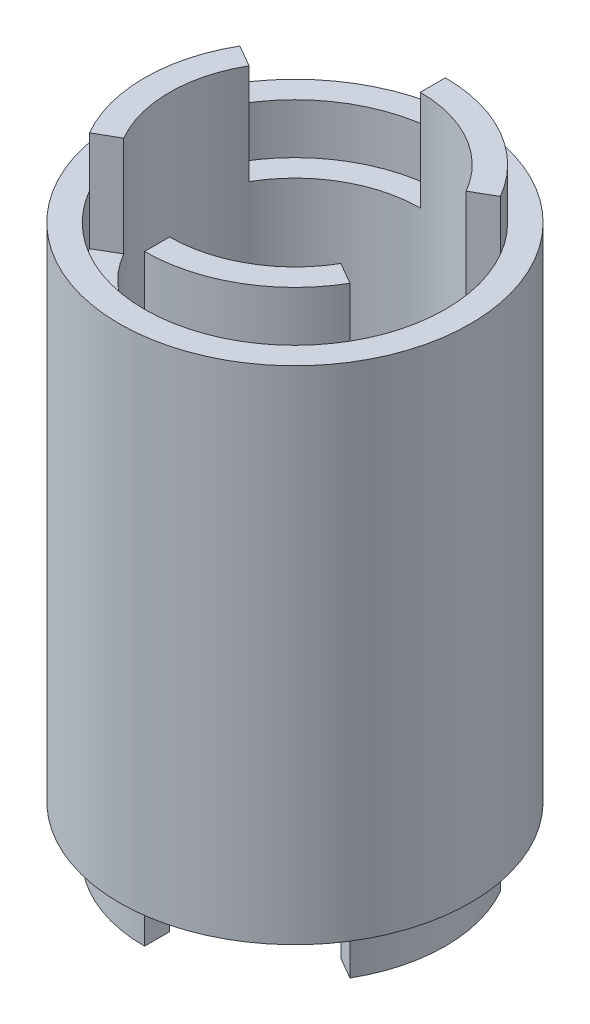
ISO-10303-21;
HEADER;
FILE_DESCRIPTION(('STEP AP214'),'2;1');
FILE_NAME('part.step','',(''),(''),'','','');
FILE_SCHEMA(('AUTOMOTIVE_DESIGN { 1 0 10303 214 1 1 1 1 }'));
ENDSEC;
DATA;
#1=APPLICATION_CONTEXT('core data for automotive mechanical design processes');
#2=APPLICATION_PROTOCOL_DEFINITION('international standard','automotive_design',2000,#1);
#3=PRODUCT_CONTEXT('',#1,'mechanical');
#4=PRODUCT('Part','Part','',(#3));
#5=PRODUCT_RELATED_PRODUCT_CATEGORY('part','',(#4));
#6=PRODUCT_DEFINITION_FORMATION('','',#4);
#7=PRODUCT_DEFINITION_CONTEXT('part definition',#1,'design');
#8=PRODUCT_DEFINITION('design','',#6,#7);
#9=PRODUCT_DEFINITION_SHAPE('','',#8);
#10=(LENGTH_UNIT() NAMED_UNIT(*) SI_UNIT(.MILLI.,.METRE.));
#11=(NAMED_UNIT(*) PLANE_ANGLE_UNIT() SI_UNIT($,.RADIAN.));
#12=(NAMED_UNIT(*) SI_UNIT($,.STERADIAN.) SOLID_ANGLE_UNIT());
#13=UNCERTAINTY_MEASURE_WITH_UNIT(LENGTH_MEASURE(1.E-05),#10,'distance_accuracy_value','');
#14=(GEOMETRIC_REPRESENTATION_CONTEXT(3) GLOBAL_UNCERTAINTY_ASSIGNED_CONTEXT((#13)) GLOBAL_UNIT_ASSIGNED_CONTEXT((#10,
#11,#12)) REPRESENTATION_CONTEXT('',''));
#15=CARTESIAN_POINT('',(0.,0.,0.));
#16=DIRECTION('',(0.,0.,1.));
#17=DIRECTION('',(1.,0.,0.));
#18=AXIS2_PLACEMENT_3D('',#15,#16,#17);
#19=CARTESIAN_POINT('',(0.,-30.,0.));
#20=DIRECTION('',(0.,1.,0.));
#21=DIRECTION('',(0.,0.,1.));
#22=AXIS2_PLACEMENT_3D('',#19,#20,#21);
#23=CYLINDRICAL_SURFACE('',#22,15.);
#24=CARTESIAN_POINT('',(0.,-30.,0.));
#25=DIRECTION('',(0.,-1.,0.));
#26=DIRECTION('',(0.,0.,-1.));
#27=AXIS2_PLACEMENT_3D('',#24,#25,#26);
#28=CIRCLE('',#27,15.);
#29=CARTESIAN_POINT('',(-12.9903810567667,-30.,-7.49999999999988));
#30=VERTEX_POINT('',#29);
#31=CARTESIAN_POINT('',(-1.04744440165294E-13,-30.,-15.));
#32=VERTEX_POINT('',#31);
#33=EDGE_CURVE('E500',#30,#32,#28,.T.);
#34=ORIENTED_EDGE('',*,*,#33,.F.);
#35=DIRECTION('',(0.,-1.,0.));
#36=VECTOR('',#35,1.);
#37=CARTESIAN_POINT('',(-12.9903810567667,-20.,-7.49999999999988));
#38=LINE('',#37,#36);
#39=CARTESIAN_POINT('',(-12.9903810567667,-25.,-7.49999999999988));
#40=VERTEX_POINT('',#39);
#41=EDGE_CURVE('E591',#40,#30,#38,.T.);
#42=ORIENTED_EDGE('',*,*,#41,.F.);
#43=CARTESIAN_POINT('',(0.,-25.,0.));
#44=DIRECTION('',(0.,1.,0.));
#45=DIRECTION('',(0.,0.,1.));
#46=AXIS2_PLACEMENT_3D('',#43,#44,#45);
#47=CIRCLE('',#46,15.);
#48=CARTESIAN_POINT('',(-1.04744440165294E-13,-25.,-15.));
#49=VERTEX_POINT('',#48);
#50=EDGE_CURVE('E511',#40,#49,#47,.F.);
#51=ORIENTED_EDGE('',*,*,#50,.T.);
#52=DIRECTION('',(0.,-1.,0.));
#53=VECTOR('',#52,1.);
#54=CARTESIAN_POINT('',(-1.04744440165294E-13,-20.,-15.));
#55=LINE('',#54,#53);
#56=EDGE_CURVE('E335',#49,#32,#55,.T.);
#57=ORIENTED_EDGE('',*,*,#56,.T.);
#58=EDGE_LOOP('',(#34,#42,#51,#57));
#59=FACE_BOUND('',#58,.T.);
#60=ADVANCED_FACE('F47',(#59),#23,.T.);
#61=CARTESIAN_POINT('',(0.,-25.,15.));
#62=VERTEX_POINT('',#61);
#63=CARTESIAN_POINT('',(-12.9903810567666,-25.,7.49999999999999));
#64=VERTEX_POINT('',#63);
#65=EDGE_CURVE('E506',#62,#64,#47,.F.);
#66=ORIENTED_EDGE('',*,*,#65,.T.);
#67=DIRECTION('',(0.,-1.,0.));
#68=VECTOR('',#67,1.);
#69=CARTESIAN_POINT('',(-12.9903810567666,-20.,7.49999999999999));
#70=LINE('',#69,#68);
#71=CARTESIAN_POINT('',(-12.9903810567666,-30.,7.49999999999999));
#72=VERTEX_POINT('',#71);
#73=EDGE_CURVE('E270',#64,#72,#70,.T.);
#74=ORIENTED_EDGE('',*,*,#73,.T.);
#75=CARTESIAN_POINT('',(0.,-30.,15.));
#76=VERTEX_POINT('',#75);
#77=EDGE_CURVE('E504',#76,#72,#28,.T.);
#78=ORIENTED_EDGE('',*,*,#77,.F.);
#79=DIRECTION('',(0.,-1.,0.));
#80=VECTOR('',#79,1.);
#81=CARTESIAN_POINT('',(0.,-20.,15.));
#82=LINE('',#81,#80);
#83=EDGE_CURVE('E291',#62,#76,#82,.T.);
#84=ORIENTED_EDGE('',*,*,#83,.F.);
#85=EDGE_LOOP('',(#66,#74,#78,#84));
#86=FACE_BOUND('',#85,.T.);
#87=ADVANCED_FACE('F601',(#86),#23,.T.);
#88=CARTESIAN_POINT('',(0.,-30.,0.));
#89=DIRECTION('',(0.,-1.,0.));
#90=DIRECTION('',(0.,0.,-1.));
#91=AXIS2_PLACEMENT_3D('',#88,#89,#90);
#92=PLANE('',#91);
#93=DIRECTION('',(0.866025403784443,0.,0.499999999999992));
#94=VECTOR('',#93,1.);
#95=CARTESIAN_POINT('',(-10.8253175473055,-30.,-6.2499999999999));
#96=LINE('',#95,#94);
#97=CARTESIAN_POINT('',(-10.8253175473055,-30.,-6.2499999999999));
#98=VERTEX_POINT('',#97);
#99=EDGE_CURVE('E262',#30,#98,#96,.T.);
#100=ORIENTED_EDGE('',*,*,#99,.F.);
#101=ORIENTED_EDGE('',*,*,#33,.T.);
#102=DIRECTION('',(0.,0.,-1.));
#103=VECTOR('',#102,1.);
#104=CARTESIAN_POINT('',(0.,-30.,-12.5));
#105=LINE('',#104,#103);
#106=CARTESIAN_POINT('',(0.,-30.,-12.5));
#107=VERTEX_POINT('',#106);
#108=EDGE_CURVE('E336',#107,#32,#105,.T.);
#109=ORIENTED_EDGE('',*,*,#108,.F.);
#110=CARTESIAN_POINT('',(0.,-30.,0.));
#111=DIRECTION('',(0.,-1.,0.));
#112=DIRECTION('',(0.,0.,-1.));
#113=AXIS2_PLACEMENT_3D('',#110,#111,#112);
#114=CIRCLE('',#113,12.5);
#115=EDGE_CURVE('E495',#98,#107,#114,.T.);
#116=ORIENTED_EDGE('',*,*,#115,.F.);
#117=EDGE_LOOP('',(#100,#101,#109,#116));
#118=FACE_BOUND('',#117,.T.);
#119=ADVANCED_FACE('F617',(#118),#92,.T.);
#120=DIRECTION('',(-0.86602540378447,0.,0.499999999999945));
#121=VECTOR('',#120,1.);
#122=CARTESIAN_POINT('',(-10.8253175473054,-30.,6.25000000000013));
#123=LINE('',#122,#121);
#124=CARTESIAN_POINT('',(-10.8253175473054,-30.,6.25000000000013));
#125=VERTEX_POINT('',#124);
#126=EDGE_CURVE('E303',#125,#72,#123,.T.);
#127=ORIENTED_EDGE('',*,*,#126,.F.);
#128=CARTESIAN_POINT('',(0.,-30.,12.5));
#129=VERTEX_POINT('',#128);
#130=EDGE_CURVE('E268',#129,#125,#114,.T.);
#131=ORIENTED_EDGE('',*,*,#130,.F.);
#132=DIRECTION('',(0.,0.,-1.));
#133=VECTOR('',#132,1.);
#134=CARTESIAN_POINT('',(0.,-30.,12.5));
#135=LINE('',#134,#133);
#136=EDGE_CURVE('E296',#76,#129,#135,.T.);
#137=ORIENTED_EDGE('',*,*,#136,.F.);
#138=ORIENTED_EDGE('',*,*,#77,.T.);
#139=EDGE_LOOP('',(#127,#131,#137,#138));
#140=FACE_BOUND('',#139,.T.);
#141=ADVANCED_FACE('F657',(#140),#92,.T.);
#142=CARTESIAN_POINT('',(0.,25.,0.));
#143=DIRECTION('',(0.,-1.,0.));
#144=DIRECTION('',(0.,0.,-1.));
#145=AXIS2_PLACEMENT_3D('',#142,#143,#144);
#146=CYLINDRICAL_SURFACE('',#145,15.);
#147=CARTESIAN_POINT('',(0.,20.,0.));
#148=DIRECTION('',(0.,1.,0.));
#149=DIRECTION('',(0.,0.,1.));
#150=AXIS2_PLACEMENT_3D('',#147,#148,#149);
#151=CIRCLE('',#150,15.);
#152=CARTESIAN_POINT('',(12.9903810567665,20.,7.50000000000006));
#153=VERTEX_POINT('',#152);
#154=CARTESIAN_POINT('',(12.9903810567666,20.,-7.5));
#155=VERTEX_POINT('',#154);
#156=EDGE_CURVE('E371',#153,#155,#151,.T.);
#157=ORIENTED_EDGE('',*,*,#156,.F.);
#158=DIRECTION('',(0.,-1.,0.));
#159=VECTOR('',#158,1.);
#160=CARTESIAN_POINT('',(12.9903810567665,30.,7.50000000000006));
#161=LINE('',#160,#159);
#162=CARTESIAN_POINT('',(12.9903810567665,25.,7.50000000000006));
#163=VERTEX_POINT('',#162);
#164=EDGE_CURVE('E404',#163,#153,#161,.T.);
#165=ORIENTED_EDGE('',*,*,#164,.F.);
#166=CARTESIAN_POINT('',(0.,25.,0.));
#167=DIRECTION('',(0.,1.,0.));
#168=DIRECTION('',(0.,0.,1.));
#169=AXIS2_PLACEMENT_3D('',#166,#167,#168);
#170=CIRCLE('',#169,15.);
#171=CARTESIAN_POINT('',(12.9903810567666,25.,-7.5));
#172=VERTEX_POINT('',#171);
#173=EDGE_CURVE('E510',#163,#172,#170,.T.);
#174=ORIENTED_EDGE('',*,*,#173,.T.);
#175=DIRECTION('',(0.,-1.,0.));
#176=VECTOR('',#175,1.);
#177=CARTESIAN_POINT('',(12.9903810567666,25.,-7.5));
#178=LINE('',#177,#176);
#179=EDGE_CURVE('E56',#172,#155,#178,.T.);
#180=ORIENTED_EDGE('',*,*,#179,.T.);
#181=EDGE_LOOP('',(#157,#165,#174,#180));
#182=FACE_BOUND('',#181,.T.);
#183=ADVANCED_FACE('F530',(#182),#146,.F.);
#184=CARTESIAN_POINT('',(0.,20.,0.));
#185=DIRECTION('',(0.,1.,0.));
#186=DIRECTION('',(0.,0.,1.));
#187=AXIS2_PLACEMENT_3D('',#184,#185,#186);
#188=CIRCLE('',#187,15.);
#189=CARTESIAN_POINT('',(-12.9903810567666,20.,7.49999999999988));
#190=VERTEX_POINT('',#189);
#191=CARTESIAN_POINT('',(0.,20.,15.));
#192=VERTEX_POINT('',#191);
#193=EDGE_CURVE('E389',#190,#192,#188,.T.);
#194=ORIENTED_EDGE('',*,*,#193,.F.);
#195=DIRECTION('',(0.,-1.,0.));
#196=VECTOR('',#195,1.);
#197=CARTESIAN_POINT('',(-12.9903810567667,30.,7.49999999999988));
#198=LINE('',#197,#196);
#199=CARTESIAN_POINT('',(-12.9903810567667,25.,7.49999999999988));
#200=VERTEX_POINT('',#199);
#201=EDGE_CURVE('E444',#200,#190,#198,.T.);
#202=ORIENTED_EDGE('',*,*,#201,.F.);
#203=CARTESIAN_POINT('',(0.,25.,15.));
#204=VERTEX_POINT('',#203);
#205=EDGE_CURVE('E554',#200,#204,#170,.T.);
#206=ORIENTED_EDGE('',*,*,#205,.T.);
#207=DIRECTION('',(0.,-1.,0.));
#208=VECTOR('',#207,1.);
#209=CARTESIAN_POINT('',(0.,30.,15.));
#210=LINE('',#209,#208);
#211=EDGE_CURVE('E417',#204,#192,#210,.T.);
#212=ORIENTED_EDGE('',*,*,#211,.T.);
#213=EDGE_LOOP('',(#194,#202,#206,#212));
#214=FACE_BOUND('',#213,.T.);
#215=ADVANCED_FACE('F665',(#214),#146,.F.);
#216=CARTESIAN_POINT('',(0.,20.,0.));
#217=DIRECTION('',(0.,1.,0.));
#218=DIRECTION('',(0.,0.,1.));
#219=AXIS2_PLACEMENT_3D('',#216,#217,#218);
#220=CIRCLE('',#219,15.);
#221=CARTESIAN_POINT('',(0.,20.,-15.));
#222=VERTEX_POINT('',#221);
#223=CARTESIAN_POINT('',(-12.9903810567666,20.,-7.49999999999999));
#224=VERTEX_POINT('',#223);
#225=EDGE_CURVE('E392',#222,#224,#220,.T.);
#226=ORIENTED_EDGE('',*,*,#225,.F.);
#227=DIRECTION('',(0.,-1.,0.));
#228=VECTOR('',#227,1.);
#229=CARTESIAN_POINT('',(0.,25.,-15.));
#230=LINE('',#229,#228);
#231=CARTESIAN_POINT('',(0.,25.,-15.));
#232=VERTEX_POINT('',#231);
#233=EDGE_CURVE('E11',#222,#232,#230,.F.);
#234=ORIENTED_EDGE('',*,*,#233,.T.);
#235=CARTESIAN_POINT('',(-12.9903810567666,25.,-7.49999999999999));
#236=VERTEX_POINT('',#235);
#237=EDGE_CURVE('E518',#232,#236,#170,.T.);
#238=ORIENTED_EDGE('',*,*,#237,.T.);
#239=DIRECTION('',(0.,-1.,0.));
#240=VECTOR('',#239,1.);
#241=CARTESIAN_POINT('',(-12.9903810567666,30.,-7.49999999999999));
#242=LINE('',#241,#240);
#243=EDGE_CURVE('E439',#236,#224,#242,.T.);
#244=ORIENTED_EDGE('',*,*,#243,.T.);
#245=EDGE_LOOP('',(#226,#234,#238,#244));
#246=FACE_BOUND('',#245,.T.);
#247=ADVANCED_FACE('F667',(#246),#146,.F.);
#248=CARTESIAN_POINT('',(0.,17.5,0.));
#249=DIRECTION('',(0.,-1.,0.));
#250=DIRECTION('',(0.,0.,-1.));
#251=AXIS2_PLACEMENT_3D('',#248,#249,#250);
#252=CYLINDRICAL_SURFACE('',#251,12.5);
#253=DIRECTION('',(0.,-1.,0.));
#254=VECTOR('',#253,1.);
#255=CARTESIAN_POINT('',(-10.8253175473055,-20.,-6.2499999999999));
#256=LINE('',#255,#254);
#257=CARTESIAN_POINT('',(-10.8253175473055,-20.,-6.2499999999999));
#258=VERTEX_POINT('',#257);
#259=EDGE_CURVE('E360',#258,#98,#256,.T.);
#260=ORIENTED_EDGE('',*,*,#259,.T.);
#261=ORIENTED_EDGE('',*,*,#115,.T.);
#262=DIRECTION('',(0.,-1.,0.));
#263=VECTOR('',#262,1.);
#264=CARTESIAN_POINT('',(0.,-20.,-12.5));
#265=LINE('',#264,#263);
#266=CARTESIAN_POINT('',(0.,-20.,-12.5));
#267=VERTEX_POINT('',#266);
#268=EDGE_CURVE('E328',#267,#107,#265,.T.);
#269=ORIENTED_EDGE('',*,*,#268,.F.);
#270=CARTESIAN_POINT('',(0.,-20.,0.));
#271=DIRECTION('',(0.,1.,0.));
#272=DIRECTION('',(0.,0.,-1.));
#273=AXIS2_PLACEMENT_3D('',#270,#271,#272);
#274=CIRCLE('',#273,12.5);
#275=CARTESIAN_POINT('',(10.8253175473055,-20.,-6.25000000000005));
#276=VERTEX_POINT('',#275);
#277=EDGE_CURVE('E345',#276,#267,#274,.T.);
#278=ORIENTED_EDGE('',*,*,#277,.F.);
#279=DIRECTION('',(0.,-1.,0.));
#280=VECTOR('',#279,1.);
#281=CARTESIAN_POINT('',(10.8253175473055,-20.,-6.25000000000005));
#282=LINE('',#281,#280);
#283=CARTESIAN_POINT('',(10.8253175473055,-30.,-6.25000000000005));
#284=VERTEX_POINT('',#283);
#285=EDGE_CURVE('E324',#276,#284,#282,.T.);
#286=ORIENTED_EDGE('',*,*,#285,.T.);
#287=CARTESIAN_POINT('',(10.8253175473055,-30.,6.24999999999998));
#288=VERTEX_POINT('',#287);
#289=EDGE_CURVE('E499',#284,#288,#114,.T.);
#290=ORIENTED_EDGE('',*,*,#289,.T.);
#291=DIRECTION('',(0.,-1.,0.));
#292=VECTOR('',#291,1.);
#293=CARTESIAN_POINT('',(10.8253175473055,-20.,6.24999999999998));
#294=LINE('',#293,#292);
#295=CARTESIAN_POINT('',(10.8253175473055,-20.,6.24999999999998));
#296=VERTEX_POINT('',#295);
#297=EDGE_CURVE('E71',#296,#288,#294,.T.);
#298=ORIENTED_EDGE('',*,*,#297,.F.);
#299=CARTESIAN_POINT('',(0.,-20.,0.));
#300=DIRECTION('',(0.,1.,0.));
#301=DIRECTION('',(0.,0.,-1.));
#302=AXIS2_PLACEMENT_3D('',#299,#300,#301);
#303=CIRCLE('',#302,12.5);
#304=CARTESIAN_POINT('',(0.,-20.,12.5));
#305=VERTEX_POINT('',#304);
#306=EDGE_CURVE('E300',#305,#296,#303,.T.);
#307=ORIENTED_EDGE('',*,*,#306,.F.);
#308=DIRECTION('',(0.,-1.,0.));
#309=VECTOR('',#308,1.);
#310=CARTESIAN_POINT('',(0.,-20.,12.5));
#311=LINE('',#310,#309);
#312=EDGE_CURVE('E292',#305,#129,#311,.T.);
#313=ORIENTED_EDGE('',*,*,#312,.T.);
#314=ORIENTED_EDGE('',*,*,#130,.T.);
#315=DIRECTION('',(0.,-1.,0.));
#316=VECTOR('',#315,1.);
#317=CARTESIAN_POINT('',(-10.8253175473054,-20.,6.25000000000013));
#318=LINE('',#317,#316);
#319=CARTESIAN_POINT('',(-10.8253175473054,-20.,6.25000000000013));
#320=VERTEX_POINT('',#319);
#321=EDGE_CURVE('E63',#320,#125,#318,.T.);
#322=ORIENTED_EDGE('',*,*,#321,.F.);
#323=CARTESIAN_POINT('',(0.,-20.,0.));
#324=DIRECTION('',(0.,1.,0.));
#325=DIRECTION('',(0.,0.,-1.));
#326=AXIS2_PLACEMENT_3D('',#323,#324,#325);
#327=CIRCLE('',#326,12.5);
#328=EDGE_CURVE('E252',#258,#320,#327,.T.);
#329=ORIENTED_EDGE('',*,*,#328,.F.);
#330=EDGE_LOOP('',(#260,#261,#269,#278,#286,#290,#298,#307,#313,#314,#322,#329));
#331=FACE_BOUND('',#330,.T.);
#332=DIRECTION('',(0.,-1.,0.));
#333=VECTOR('',#332,1.);
#334=CARTESIAN_POINT('',(0.,30.,-12.5));
#335=LINE('',#334,#333);
#336=CARTESIAN_POINT('',(0.,30.,-12.5));
#337=VERTEX_POINT('',#336);
#338=CARTESIAN_POINT('',(0.,20.,-12.5));
#339=VERTEX_POINT('',#338);
#340=EDGE_CURVE('E487',#337,#339,#335,.T.);
#341=ORIENTED_EDGE('',*,*,#340,.T.);
#342=CARTESIAN_POINT('',(0.,20.,0.));
#343=DIRECTION('',(0.,-1.,0.));
#344=DIRECTION('',(0.,0.,1.));
#345=AXIS2_PLACEMENT_3D('',#342,#343,#344);
#346=CIRCLE('',#345,12.5);
#347=CARTESIAN_POINT('',(-10.8253175473055,20.,-6.25));
#348=VERTEX_POINT('',#347);
#349=EDGE_CURVE('E398',#348,#339,#346,.T.);
#350=ORIENTED_EDGE('',*,*,#349,.F.);
#351=DIRECTION('',(0.,-1.,0.));
#352=VECTOR('',#351,1.);
#353=CARTESIAN_POINT('',(-10.8253175473055,30.,-6.24999999999999));
#354=LINE('',#353,#352);
#355=CARTESIAN_POINT('',(-10.8253175473055,30.,-6.24999999999999));
#356=VERTEX_POINT('',#355);
#357=EDGE_CURVE('E435',#356,#348,#354,.T.);
#358=ORIENTED_EDGE('',*,*,#357,.F.);
#359=CARTESIAN_POINT('',(0.,30.,0.));
#360=DIRECTION('',(0.,-1.,0.));
#361=DIRECTION('',(0.,0.,1.));
#362=AXIS2_PLACEMENT_3D('',#359,#360,#361);
#363=CIRCLE('',#362,12.5);
#364=CARTESIAN_POINT('',(-10.8253175473055,30.,6.2499999999999));
#365=VERTEX_POINT('',#364);
#366=EDGE_CURVE('E462',#365,#356,#363,.T.);
#367=ORIENTED_EDGE('',*,*,#366,.F.);
#368=DIRECTION('',(0.,-1.,0.));
#369=VECTOR('',#368,1.);
#370=CARTESIAN_POINT('',(-10.8253175473055,30.,6.2499999999999));
#371=LINE('',#370,#369);
#372=CARTESIAN_POINT('',(-10.8253175473055,20.,6.2499999999999));
#373=VERTEX_POINT('',#372);
#374=EDGE_CURVE('E449',#365,#373,#371,.T.);
#375=ORIENTED_EDGE('',*,*,#374,.T.);
#376=CARTESIAN_POINT('',(0.,20.,0.));
#377=DIRECTION('',(0.,-1.,0.));
#378=DIRECTION('',(0.,0.,1.));
#379=AXIS2_PLACEMENT_3D('',#376,#377,#378);
#380=CIRCLE('',#379,12.5);
#381=CARTESIAN_POINT('',(0.,20.,12.5));
#382=VERTEX_POINT('',#381);
#383=EDGE_CURVE('E383',#382,#373,#380,.T.);
#384=ORIENTED_EDGE('',*,*,#383,.F.);
#385=DIRECTION('',(0.,-1.,0.));
#386=VECTOR('',#385,1.);
#387=CARTESIAN_POINT('',(0.,30.,12.5));
#388=LINE('',#387,#386);
#389=CARTESIAN_POINT('',(0.,30.,12.5));
#390=VERTEX_POINT('',#389);
#391=EDGE_CURVE('E413',#390,#382,#388,.T.);
#392=ORIENTED_EDGE('',*,*,#391,.F.);
#393=CARTESIAN_POINT('',(0.,30.,0.));
#394=DIRECTION('',(0.,-1.,0.));
#395=DIRECTION('',(0.,0.,1.));
#396=AXIS2_PLACEMENT_3D('',#393,#394,#395);
#397=CIRCLE('',#396,12.5);
#398=CARTESIAN_POINT('',(10.8253175473055,30.,6.25000000000005));
#399=VERTEX_POINT('',#398);
#400=EDGE_CURVE('E425',#399,#390,#397,.T.);
#401=ORIENTED_EDGE('',*,*,#400,.F.);
#402=DIRECTION('',(0.,-1.,0.));
#403=VECTOR('',#402,1.);
#404=CARTESIAN_POINT('',(10.8253175473055,30.,6.25000000000005));
#405=LINE('',#404,#403);
#406=CARTESIAN_POINT('',(10.8253175473055,20.,6.25000000000005));
#407=VERTEX_POINT('',#406);
#408=EDGE_CURVE('E409',#399,#407,#405,.T.);
#409=ORIENTED_EDGE('',*,*,#408,.T.);
#410=CARTESIAN_POINT('',(0.,20.,0.));
#411=DIRECTION('',(0.,-1.,0.));
#412=DIRECTION('',(0.,0.,1.));
#413=AXIS2_PLACEMENT_3D('',#410,#411,#412);
#414=CIRCLE('',#413,12.5);
#415=CARTESIAN_POINT('',(10.8253175473055,20.,-6.25));
#416=VERTEX_POINT('',#415);
#417=EDGE_CURVE('E377',#416,#407,#414,.T.);
#418=ORIENTED_EDGE('',*,*,#417,.F.);
#419=DIRECTION('',(0.,-1.,0.));
#420=VECTOR('',#419,1.);
#421=CARTESIAN_POINT('',(10.8253175473055,30.,-6.25));
#422=LINE('',#421,#420);
#423=CARTESIAN_POINT('',(10.8253175473055,30.,-6.25));
#424=VERTEX_POINT('',#423);
#425=EDGE_CURVE('E483',#424,#416,#422,.T.);
#426=ORIENTED_EDGE('',*,*,#425,.F.);
#427=CARTESIAN_POINT('',(0.,30.,0.));
#428=DIRECTION('',(0.,-1.,0.));
#429=DIRECTION('',(0.,0.,1.));
#430=AXIS2_PLACEMENT_3D('',#427,#428,#429);
#431=CIRCLE('',#430,12.5);
#432=EDGE_CURVE('E473',#337,#424,#431,.T.);
#433=ORIENTED_EDGE('',*,*,#432,.F.);
#434=EDGE_LOOP('',(#341,#350,#358,#367,#375,#384,#392,#401,#409,#418,#426,#433));
#435=FACE_BOUND('',#434,.T.);
#436=ADVANCED_FACE('F49',(#331,#435),#252,.F.);
#437=CARTESIAN_POINT('',(0.,25.,0.));
#438=DIRECTION('',(0.,1.,0.));
#439=DIRECTION('',(0.,0.,1.));
#440=AXIS2_PLACEMENT_3D('',#437,#438,#439);
#441=PLANE('',#440);
#442=CARTESIAN_POINT('',(0.,25.,0.));
#443=DIRECTION('',(0.,1.,0.));
#444=DIRECTION('',(0.,0.,1.));
#445=AXIS2_PLACEMENT_3D('',#442,#443,#444);
#446=CIRCLE('',#445,17.5);
#447=CARTESIAN_POINT('',(0.,25.,17.5));
#448=VERTEX_POINT('',#447);
#449=EDGE_CURVE('E519',#448,#448,#446,.T.);
#450=ORIENTED_EDGE('',*,*,#449,.T.);
#451=EDGE_LOOP('',(#450));
#452=FACE_BOUND('',#451,.T.);
#453=EDGE_CURVE('E513',#172,#232,#170,.T.);
#454=ORIENTED_EDGE('',*,*,#453,.F.);
#455=ORIENTED_EDGE('',*,*,#173,.F.);
#456=EDGE_CURVE('E559',#204,#163,#170,.T.);
#457=ORIENTED_EDGE('',*,*,#456,.F.);
#458=ORIENTED_EDGE('',*,*,#205,.F.);
#459=EDGE_CURVE('E548',#236,#200,#170,.T.);
#460=ORIENTED_EDGE('',*,*,#459,.F.);
#461=ORIENTED_EDGE('',*,*,#237,.F.);
#462=EDGE_LOOP('',(#454,#455,#457,#458,#460,#461));
#463=FACE_BOUND('',#462,.T.);
#464=ADVANCED_FACE('F545',(#452,#463),#441,.T.);
#465=CARTESIAN_POINT('',(0.,-25.,0.));
#466=DIRECTION('',(0.,1.,0.));
#467=DIRECTION('',(0.,0.,1.));
#468=AXIS2_PLACEMENT_3D('',#465,#466,#467);
#469=PLANE('',#468);
#470=CARTESIAN_POINT('',(0.,-25.,0.));
#471=DIRECTION('',(0.,1.,0.));
#472=DIRECTION('',(0.,0.,1.));
#473=AXIS2_PLACEMENT_3D('',#470,#471,#472);
#474=CIRCLE('',#473,17.5);
#475=CARTESIAN_POINT('',(0.,-25.,17.5));
#476=VERTEX_POINT('',#475);
#477=EDGE_CURVE('E517',#476,#476,#474,.T.);
#478=ORIENTED_EDGE('',*,*,#477,.F.);
#479=EDGE_LOOP('',(#478));
#480=FACE_BOUND('',#479,.T.);
#481=ORIENTED_EDGE('',*,*,#65,.F.);
#482=CARTESIAN_POINT('',(0.,-25.,0.));
#483=DIRECTION('',(0.,1.,0.));
#484=DIRECTION('',(0.,0.,1.));
#485=AXIS2_PLACEMENT_3D('',#482,#483,#484);
#486=CIRCLE('',#485,15.);
#487=CARTESIAN_POINT('',(12.9903810567666,-25.,7.49999999999997));
#488=VERTEX_POINT('',#487);
#489=EDGE_CURVE('E359',#62,#488,#486,.T.);
#490=ORIENTED_EDGE('',*,*,#489,.T.);
#491=CARTESIAN_POINT('',(12.9903810567665,-25.,-7.50000000000006));
#492=VERTEX_POINT('',#491);
#493=EDGE_CURVE('E512',#492,#488,#47,.F.);
#494=ORIENTED_EDGE('',*,*,#493,.F.);
#495=CARTESIAN_POINT('',(0.,-25.,0.));
#496=DIRECTION('',(0.,1.,0.));
#497=DIRECTION('',(0.,0.,1.));
#498=AXIS2_PLACEMENT_3D('',#495,#496,#497);
#499=CIRCLE('',#498,15.);
#500=EDGE_CURVE('E355',#492,#49,#499,.T.);
#501=ORIENTED_EDGE('',*,*,#500,.T.);
#502=ORIENTED_EDGE('',*,*,#50,.F.);
#503=CARTESIAN_POINT('',(0.,-25.,0.));
#504=DIRECTION('',(0.,1.,0.));
#505=DIRECTION('',(0.,0.,1.));
#506=AXIS2_PLACEMENT_3D('',#503,#504,#505);
#507=CIRCLE('',#506,15.);
#508=EDGE_CURVE('E364',#40,#64,#507,.T.);
#509=ORIENTED_EDGE('',*,*,#508,.T.);
#510=EDGE_LOOP('',(#481,#490,#494,#501,#502,#509));
#511=FACE_BOUND('',#510,.T.);
#512=ADVANCED_FACE('F598',(#480,#511),#469,.F.);
#513=CARTESIAN_POINT('',(0.,25.,0.));
#514=DIRECTION('',(0.,-1.,0.));
#515=DIRECTION('',(0.,0.,-1.));
#516=AXIS2_PLACEMENT_3D('',#513,#514,#515);
#517=CYLINDRICAL_SURFACE('',#516,17.5);
#518=ORIENTED_EDGE('',*,*,#449,.F.);
#519=EDGE_LOOP('',(#518));
#520=FACE_BOUND('',#519,.T.);
#521=ORIENTED_EDGE('',*,*,#477,.T.);
#522=EDGE_LOOP('',(#521));
#523=FACE_BOUND('',#522,.T.);
#524=ADVANCED_FACE('F677',(#520,#523),#517,.T.);
#525=ORIENTED_EDGE('',*,*,#493,.T.);
#526=DIRECTION('',(0.,-1.,0.));
#527=VECTOR('',#526,1.);
#528=CARTESIAN_POINT('',(12.9903810567666,-20.,7.49999999999997));
#529=LINE('',#528,#527);
#530=CARTESIAN_POINT('',(12.9903810567666,-30.,7.49999999999997));
#531=VERTEX_POINT('',#530);
#532=EDGE_CURVE('E286',#488,#531,#529,.T.);
#533=ORIENTED_EDGE('',*,*,#532,.T.);
#534=CARTESIAN_POINT('',(12.9903810567665,-30.,-7.50000000000006));
#535=VERTEX_POINT('',#534);
#536=EDGE_CURVE('E505',#535,#531,#28,.T.);
#537=ORIENTED_EDGE('',*,*,#536,.F.);
#538=DIRECTION('',(0.,-1.,0.));
#539=VECTOR('',#538,1.);
#540=CARTESIAN_POINT('',(12.9903810567665,-20.,-7.50000000000006));
#541=LINE('',#540,#539);
#542=EDGE_CURVE('E323',#492,#535,#541,.T.);
#543=ORIENTED_EDGE('',*,*,#542,.F.);
#544=EDGE_LOOP('',(#525,#533,#537,#543));
#545=FACE_BOUND('',#544,.T.);
#546=ADVANCED_FACE('F646',(#545),#23,.T.);
#547=DIRECTION('',(0.86602540378444,0.,0.499999999999998));
#548=VECTOR('',#547,1.);
#549=CARTESIAN_POINT('',(10.8253175473055,-30.,6.24999999999998));
#550=LINE('',#549,#548);
#551=EDGE_CURVE('E299',#288,#531,#550,.T.);
#552=ORIENTED_EDGE('',*,*,#551,.F.);
#553=ORIENTED_EDGE('',*,*,#289,.F.);
#554=DIRECTION('',(-0.866025403784436,0.,0.500000000000004));
#555=VECTOR('',#554,1.);
#556=CARTESIAN_POINT('',(10.8253175473055,-30.,-6.25000000000005));
#557=LINE('',#556,#555);
#558=EDGE_CURVE('E295',#535,#284,#557,.T.);
#559=ORIENTED_EDGE('',*,*,#558,.F.);
#560=ORIENTED_EDGE('',*,*,#536,.T.);
#561=EDGE_LOOP('',(#552,#553,#559,#560));
#562=FACE_BOUND('',#561,.T.);
#563=ADVANCED_FACE('F641',(#562),#92,.T.);
#564=CARTESIAN_POINT('',(0.,30.,0.));
#565=DIRECTION('',(0.,-1.,0.));
#566=DIRECTION('',(0.,0.,-1.));
#567=AXIS2_PLACEMENT_3D('',#564,#565,#566);
#568=CYLINDRICAL_SURFACE('',#567,15.);
#569=ORIENTED_EDGE('',*,*,#453,.T.);
#570=DIRECTION('',(0.,-1.,0.));
#571=VECTOR('',#570,1.);
#572=CARTESIAN_POINT('',(0.,30.,-15.));
#573=LINE('',#572,#571);
#574=CARTESIAN_POINT('',(0.,30.,-15.));
#575=VERTEX_POINT('',#574);
#576=EDGE_CURVE('E491',#575,#232,#573,.T.);
#577=ORIENTED_EDGE('',*,*,#576,.F.);
#578=CARTESIAN_POINT('',(0.,30.,0.));
#579=DIRECTION('',(0.,1.,0.));
#580=DIRECTION('',(0.,0.,1.));
#581=AXIS2_PLACEMENT_3D('',#578,#579,#580);
#582=CIRCLE('',#581,15.);
#583=CARTESIAN_POINT('',(12.9903810567666,30.,-7.5));
#584=VERTEX_POINT('',#583);
#585=EDGE_CURVE('E466',#584,#575,#582,.T.);
#586=ORIENTED_EDGE('',*,*,#585,.F.);
#587=DIRECTION('',(0.,-1.,0.));
#588=VECTOR('',#587,1.);
#589=CARTESIAN_POINT('',(12.9903810567666,30.,-7.5));
#590=LINE('',#589,#588);
#591=EDGE_CURVE('E479',#584,#172,#590,.T.);
#592=ORIENTED_EDGE('',*,*,#591,.T.);
#593=EDGE_LOOP('',(#569,#577,#586,#592));
#594=FACE_BOUND('',#593,.T.);
#595=ADVANCED_FACE('F541',(#594),#568,.T.);
#596=CARTESIAN_POINT('',(0.,30.,-12.5));
#597=DIRECTION('',(1.,0.,0.));
#598=DIRECTION('',(0.,0.,-1.));
#599=AXIS2_PLACEMENT_3D('',#596,#597,#598);
#600=PLANE('',#599);
#601=ORIENTED_EDGE('',*,*,#233,.F.);
#602=DIRECTION('',(0.,0.,-1.));
#603=VECTOR('',#602,1.);
#604=CARTESIAN_POINT('',(0.,20.,-12.5));
#605=LINE('',#604,#603);
#606=EDGE_CURVE('E401',#339,#222,#605,.T.);
#607=ORIENTED_EDGE('',*,*,#606,.F.);
#608=ORIENTED_EDGE('',*,*,#340,.F.);
#609=DIRECTION('',(0.,0.,1.));
#610=VECTOR('',#609,1.);
#611=CARTESIAN_POINT('',(0.,30.,-12.5));
#612=LINE('',#611,#610);
#613=EDGE_CURVE('E470',#575,#337,#612,.T.);
#614=ORIENTED_EDGE('',*,*,#613,.F.);
#615=ORIENTED_EDGE('',*,*,#576,.T.);
#616=EDGE_LOOP('',(#601,#607,#608,#614,#615));
#617=FACE_BOUND('',#616,.T.);
#618=ADVANCED_FACE('F703',(#617),#600,.F.);
#619=CARTESIAN_POINT('',(10.8253175473055,30.,-6.25));
#620=DIRECTION('',(-0.5,0.,-0.866025403784439));
#621=DIRECTION('',(-0.866025403784439,0.,0.5));
#622=AXIS2_PLACEMENT_3D('',#619,#620,#621);
#623=PLANE('',#622);
#624=ORIENTED_EDGE('',*,*,#425,.T.);
#625=DIRECTION('',(-0.866025403784438,0.,0.500000000000001));
#626=VECTOR('',#625,1.);
#627=CARTESIAN_POINT('',(12.9903810567666,20.,-7.5));
#628=LINE('',#627,#626);
#629=EDGE_CURVE('E368',#155,#416,#628,.T.);
#630=ORIENTED_EDGE('',*,*,#629,.F.);
#631=ORIENTED_EDGE('',*,*,#179,.F.);
#632=ORIENTED_EDGE('',*,*,#591,.F.);
#633=DIRECTION('',(0.866025403784439,0.,-0.5));
#634=VECTOR('',#633,1.);
#635=CARTESIAN_POINT('',(10.8253175473055,30.,-6.25));
#636=LINE('',#635,#634);
#637=EDGE_CURVE('E476',#424,#584,#636,.T.);
#638=ORIENTED_EDGE('',*,*,#637,.F.);
#639=EDGE_LOOP('',(#624,#630,#631,#632,#638));
#640=FACE_BOUND('',#639,.T.);
#641=ADVANCED_FACE('F536',(#640),#623,.F.);
#642=CARTESIAN_POINT('',(0.,30.,0.));
#643=DIRECTION('',(0.,1.,0.));
#644=DIRECTION('',(0.,0.,1.));
#645=AXIS2_PLACEMENT_3D('',#642,#643,#644);
#646=PLANE('',#645);
#647=ORIENTED_EDGE('',*,*,#585,.T.);
#648=ORIENTED_EDGE('',*,*,#613,.T.);
#649=ORIENTED_EDGE('',*,*,#432,.T.);
#650=ORIENTED_EDGE('',*,*,#637,.T.);
#651=EDGE_LOOP('',(#647,#648,#649,#650));
#652=FACE_BOUND('',#651,.T.);
#653=ADVANCED_FACE('F707',(#652),#646,.T.);
#654=CARTESIAN_POINT('',(-10.8253175473055,30.,-6.24999999999999));
#655=DIRECTION('',(-0.499999999999999,0.,0.866025403784439));
#656=DIRECTION('',(0.866025403784439,0.,0.499999999999999));
#657=AXIS2_PLACEMENT_3D('',#654,#655,#656);
#658=PLANE('',#657);
#659=ORIENTED_EDGE('',*,*,#357,.T.);
#660=DIRECTION('',(0.86602540378444,0.,0.499999999999999));
#661=VECTOR('',#660,1.);
#662=CARTESIAN_POINT('',(-12.9903810567666,20.,-7.49999999999999));
#663=LINE('',#662,#661);
#664=EDGE_CURVE('E395',#224,#348,#663,.T.);
#665=ORIENTED_EDGE('',*,*,#664,.F.);
#666=ORIENTED_EDGE('',*,*,#243,.F.);
#667=CARTESIAN_POINT('',(-12.9903810567666,30.,-7.49999999999999));
#668=VERTEX_POINT('',#667);
#669=EDGE_CURVE('E440',#668,#236,#242,.T.);
#670=ORIENTED_EDGE('',*,*,#669,.F.);
#671=DIRECTION('',(-0.866025403784439,0.,-0.499999999999999));
#672=VECTOR('',#671,1.);
#673=CARTESIAN_POINT('',(-10.8253175473055,30.,-6.24999999999999));
#674=LINE('',#673,#672);
#675=EDGE_CURVE('E459',#356,#668,#674,.T.);
#676=ORIENTED_EDGE('',*,*,#675,.F.);
#677=EDGE_LOOP('',(#659,#665,#666,#670,#676));
#678=FACE_BOUND('',#677,.T.);
#679=ADVANCED_FACE('F742',(#678),#658,.F.);
#680=CARTESIAN_POINT('',(0.,30.,0.));
#681=DIRECTION('',(0.,-1.,0.));
#682=DIRECTION('',(0.,0.,-1.));
#683=AXIS2_PLACEMENT_3D('',#680,#681,#682);
#684=CYLINDRICAL_SURFACE('',#683,15.);
#685=ORIENTED_EDGE('',*,*,#459,.T.);
#686=CARTESIAN_POINT('',(-12.9903810567667,30.,7.49999999999988));
#687=VERTEX_POINT('',#686);
#688=EDGE_CURVE('E445',#687,#200,#198,.T.);
#689=ORIENTED_EDGE('',*,*,#688,.F.);
#690=CARTESIAN_POINT('',(0.,30.,0.));
#691=DIRECTION('',(0.,1.,0.));
#692=DIRECTION('',(0.,0.,1.));
#693=AXIS2_PLACEMENT_3D('',#690,#691,#692);
#694=CIRCLE('',#693,15.);
#695=EDGE_CURVE('E456',#668,#687,#694,.T.);
#696=ORIENTED_EDGE('',*,*,#695,.F.);
#697=ORIENTED_EDGE('',*,*,#669,.T.);
#698=EDGE_LOOP('',(#685,#689,#696,#697));
#699=FACE_BOUND('',#698,.T.);
#700=ADVANCED_FACE('F735',(#699),#684,.T.);
#701=CARTESIAN_POINT('',(-10.8253175473055,30.,6.2499999999999));
#702=DIRECTION('',(-0.499999999999992,0.,-0.866025403784443));
#703=DIRECTION('',(-0.866025403784443,0.,0.499999999999992));
#704=AXIS2_PLACEMENT_3D('',#701,#702,#703);
#705=PLANE('',#704);
#706=ORIENTED_EDGE('',*,*,#201,.T.);
#707=DIRECTION('',(-0.866025403784443,0.,0.499999999999992));
#708=VECTOR('',#707,1.);
#709=CARTESIAN_POINT('',(-10.8253175473055,20.,6.2499999999999));
#710=LINE('',#709,#708);
#711=EDGE_CURVE('E380',#373,#190,#710,.T.);
#712=ORIENTED_EDGE('',*,*,#711,.F.);
#713=ORIENTED_EDGE('',*,*,#374,.F.);
#714=DIRECTION('',(0.866025403784443,0.,-0.499999999999992));
#715=VECTOR('',#714,1.);
#716=CARTESIAN_POINT('',(-10.8253175473055,30.,6.2499999999999));
#717=LINE('',#716,#715);
#718=EDGE_CURVE('E453',#687,#365,#717,.T.);
#719=ORIENTED_EDGE('',*,*,#718,.F.);
#720=ORIENTED_EDGE('',*,*,#688,.T.);
#721=EDGE_LOOP('',(#706,#712,#713,#719,#720));
#722=FACE_BOUND('',#721,.T.);
#723=ADVANCED_FACE('F731',(#722),#705,.F.);
#724=CARTESIAN_POINT('',(0.,30.,0.));
#725=DIRECTION('',(0.,1.,0.));
#726=DIRECTION('',(0.,0.,1.));
#727=AXIS2_PLACEMENT_3D('',#724,#725,#726);
#728=PLANE('',#727);
#729=ORIENTED_EDGE('',*,*,#366,.T.);
#730=ORIENTED_EDGE('',*,*,#675,.T.);
#731=ORIENTED_EDGE('',*,*,#695,.T.);
#732=ORIENTED_EDGE('',*,*,#718,.T.);
#733=EDGE_LOOP('',(#729,#730,#731,#732));
#734=FACE_BOUND('',#733,.T.);
#735=ADVANCED_FACE('F738',(#734),#728,.T.);
#736=CARTESIAN_POINT('',(0.,30.,0.));
#737=DIRECTION('',(0.,-1.,0.));
#738=DIRECTION('',(0.,0.,-1.));
#739=AXIS2_PLACEMENT_3D('',#736,#737,#738);
#740=CYLINDRICAL_SURFACE('',#739,15.);
#741=ORIENTED_EDGE('',*,*,#456,.T.);
#742=CARTESIAN_POINT('',(12.9903810567665,30.,7.50000000000006));
#743=VERTEX_POINT('',#742);
#744=EDGE_CURVE('E405',#743,#163,#161,.T.);
#745=ORIENTED_EDGE('',*,*,#744,.F.);
#746=CARTESIAN_POINT('',(0.,30.,0.));
#747=DIRECTION('',(0.,1.,0.));
#748=DIRECTION('',(0.,0.,1.));
#749=AXIS2_PLACEMENT_3D('',#746,#747,#748);
#750=CIRCLE('',#749,15.);
#751=CARTESIAN_POINT('',(0.,30.,15.));
#752=VERTEX_POINT('',#751);
#753=EDGE_CURVE('E431',#752,#743,#750,.T.);
#754=ORIENTED_EDGE('',*,*,#753,.F.);
#755=EDGE_CURVE('E418',#752,#204,#210,.T.);
#756=ORIENTED_EDGE('',*,*,#755,.T.);
#757=EDGE_LOOP('',(#741,#745,#754,#756));
#758=FACE_BOUND('',#757,.T.);
#759=ADVANCED_FACE('F718',(#758),#740,.T.);
#760=CARTESIAN_POINT('',(10.8253175473055,30.,6.25000000000005));
#761=DIRECTION('',(-0.500000000000004,0.,0.866025403784436));
#762=DIRECTION('',(0.866025403784436,0.,0.500000000000004));
#763=AXIS2_PLACEMENT_3D('',#760,#761,#762);
#764=PLANE('',#763);
#765=ORIENTED_EDGE('',*,*,#164,.T.);
#766=DIRECTION('',(0.866025403784436,0.,0.500000000000004));
#767=VECTOR('',#766,1.);
#768=CARTESIAN_POINT('',(10.8253175473055,20.,6.25000000000005));
#769=LINE('',#768,#767);
#770=EDGE_CURVE('E374',#407,#153,#769,.T.);
#771=ORIENTED_EDGE('',*,*,#770,.F.);
#772=ORIENTED_EDGE('',*,*,#408,.F.);
#773=DIRECTION('',(-0.866025403784436,0.,-0.500000000000004));
#774=VECTOR('',#773,1.);
#775=CARTESIAN_POINT('',(10.8253175473055,30.,6.25000000000005));
#776=LINE('',#775,#774);
#777=EDGE_CURVE('E428',#743,#399,#776,.T.);
#778=ORIENTED_EDGE('',*,*,#777,.F.);
#779=ORIENTED_EDGE('',*,*,#744,.T.);
#780=EDGE_LOOP('',(#765,#771,#772,#778,#779));
#781=FACE_BOUND('',#780,.T.);
#782=ADVANCED_FACE('F716',(#781),#764,.F.);
#783=CARTESIAN_POINT('',(0.,30.,12.5));
#784=DIRECTION('',(1.,0.,0.));
#785=DIRECTION('',(0.,0.,-1.));
#786=AXIS2_PLACEMENT_3D('',#783,#784,#785);
#787=PLANE('',#786);
#788=ORIENTED_EDGE('',*,*,#391,.T.);
#789=DIRECTION('',(0.,0.,-1.));
#790=VECTOR('',#789,1.);
#791=CARTESIAN_POINT('',(0.,20.,15.));
#792=LINE('',#791,#790);
#793=EDGE_CURVE('E386',#192,#382,#792,.T.);
#794=ORIENTED_EDGE('',*,*,#793,.F.);
#795=ORIENTED_EDGE('',*,*,#211,.F.);
#796=ORIENTED_EDGE('',*,*,#755,.F.);
#797=DIRECTION('',(0.,0.,1.));
#798=VECTOR('',#797,1.);
#799=CARTESIAN_POINT('',(0.,30.,12.5));
#800=LINE('',#799,#798);
#801=EDGE_CURVE('E422',#390,#752,#800,.T.);
#802=ORIENTED_EDGE('',*,*,#801,.F.);
#803=EDGE_LOOP('',(#788,#794,#795,#796,#802));
#804=FACE_BOUND('',#803,.T.);
#805=ADVANCED_FACE('F725',(#804),#787,.F.);
#806=CARTESIAN_POINT('',(0.,30.,0.));
#807=DIRECTION('',(0.,1.,0.));
#808=DIRECTION('',(0.,0.,1.));
#809=AXIS2_PLACEMENT_3D('',#806,#807,#808);
#810=PLANE('',#809);
#811=ORIENTED_EDGE('',*,*,#753,.T.);
#812=ORIENTED_EDGE('',*,*,#777,.T.);
#813=ORIENTED_EDGE('',*,*,#400,.T.);
#814=ORIENTED_EDGE('',*,*,#801,.T.);
#815=EDGE_LOOP('',(#811,#812,#813,#814));
#816=FACE_BOUND('',#815,.T.);
#817=ADVANCED_FACE('F721',(#816),#810,.T.);
#818=CARTESIAN_POINT('',(0.,20.,0.));
#819=DIRECTION('',(0.,1.,0.));
#820=DIRECTION('',(0.,0.,1.));
#821=AXIS2_PLACEMENT_3D('',#818,#819,#820);
#822=PLANE('',#821);
#823=ORIENTED_EDGE('',*,*,#225,.T.);
#824=ORIENTED_EDGE('',*,*,#664,.T.);
#825=ORIENTED_EDGE('',*,*,#349,.T.);
#826=ORIENTED_EDGE('',*,*,#606,.T.);
#827=EDGE_LOOP('',(#823,#824,#825,#826));
#828=FACE_BOUND('',#827,.T.);
#829=ADVANCED_FACE('F744',(#828),#822,.T.);
#830=CARTESIAN_POINT('',(0.,20.,0.));
#831=DIRECTION('',(0.,1.,0.));
#832=DIRECTION('',(0.,0.,1.));
#833=AXIS2_PLACEMENT_3D('',#830,#831,#832);
#834=PLANE('',#833);
#835=ORIENTED_EDGE('',*,*,#193,.T.);
#836=ORIENTED_EDGE('',*,*,#793,.T.);
#837=ORIENTED_EDGE('',*,*,#383,.T.);
#838=ORIENTED_EDGE('',*,*,#711,.T.);
#839=EDGE_LOOP('',(#835,#836,#837,#838));
#840=FACE_BOUND('',#839,.T.);
#841=ADVANCED_FACE('F746',(#840),#834,.T.);
#842=CARTESIAN_POINT('',(0.,20.,0.));
#843=DIRECTION('',(0.,1.,0.));
#844=DIRECTION('',(0.,0.,1.));
#845=AXIS2_PLACEMENT_3D('',#842,#843,#844);
#846=PLANE('',#845);
#847=ORIENTED_EDGE('',*,*,#417,.T.);
#848=ORIENTED_EDGE('',*,*,#770,.T.);
#849=ORIENTED_EDGE('',*,*,#156,.T.);
#850=ORIENTED_EDGE('',*,*,#629,.T.);
#851=EDGE_LOOP('',(#847,#848,#849,#850));
#852=FACE_BOUND('',#851,.T.);
#853=ADVANCED_FACE('F714',(#852),#846,.T.);
#854=CARTESIAN_POINT('',(0.,-20.,0.));
#855=DIRECTION('',(0.,-1.,0.));
#856=DIRECTION('',(0.,0.,-1.));
#857=AXIS2_PLACEMENT_3D('',#854,#855,#856);
#858=CYLINDRICAL_SURFACE('',#857,15.);
#859=CARTESIAN_POINT('',(12.9903810567665,-20.,-7.50000000000006));
#860=VERTEX_POINT('',#859);
#861=EDGE_CURVE('E318',#860,#492,#541,.T.);
#862=ORIENTED_EDGE('',*,*,#861,.F.);
#863=CARTESIAN_POINT('',(0.,-20.,0.));
#864=DIRECTION('',(0.,-1.,0.));
#865=DIRECTION('',(0.,0.,-1.));
#866=AXIS2_PLACEMENT_3D('',#863,#864,#865);
#867=CIRCLE('',#866,15.);
#868=CARTESIAN_POINT('',(-1.04744440165294E-13,-20.,-15.));
#869=VERTEX_POINT('',#868);
#870=EDGE_CURVE('E339',#869,#860,#867,.T.);
#871=ORIENTED_EDGE('',*,*,#870,.F.);
#872=EDGE_CURVE('E331',#869,#49,#55,.T.);
#873=ORIENTED_EDGE('',*,*,#872,.T.);
#874=ORIENTED_EDGE('',*,*,#500,.F.);
#875=EDGE_LOOP('',(#862,#871,#873,#874));
#876=FACE_BOUND('',#875,.T.);
#877=ADVANCED_FACE('F752',(#876),#858,.F.);
#878=CARTESIAN_POINT('',(0.,-20.,-12.5));
#879=DIRECTION('',(-1.,0.,0.));
#880=DIRECTION('',(0.,0.,1.));
#881=AXIS2_PLACEMENT_3D('',#878,#879,#880);
#882=PLANE('',#881);
#883=ORIENTED_EDGE('',*,*,#108,.T.);
#884=ORIENTED_EDGE('',*,*,#56,.F.);
#885=ORIENTED_EDGE('',*,*,#872,.F.);
#886=DIRECTION('',(0.,0.,-1.));
#887=VECTOR('',#886,1.);
#888=CARTESIAN_POINT('',(0.,-20.,-12.5));
#889=LINE('',#888,#887);
#890=EDGE_CURVE('E322',#267,#869,#889,.T.);
#891=ORIENTED_EDGE('',*,*,#890,.F.);
#892=ORIENTED_EDGE('',*,*,#268,.T.);
#893=EDGE_LOOP('',(#883,#884,#885,#891,#892));
#894=FACE_BOUND('',#893,.T.);
#895=ADVANCED_FACE('F630',(#894),#882,.F.);
#896=CARTESIAN_POINT('',(10.8253175473055,-20.,-6.25000000000005));
#897=DIRECTION('',(0.500000000000004,0.,0.866025403784436));
#898=DIRECTION('',(0.866025403784436,0.,-0.500000000000004));
#899=AXIS2_PLACEMENT_3D('',#896,#897,#898);
#900=PLANE('',#899);
#901=ORIENTED_EDGE('',*,*,#558,.T.);
#902=ORIENTED_EDGE('',*,*,#285,.F.);
#903=DIRECTION('',(-0.866025403784436,0.,0.500000000000004));
#904=VECTOR('',#903,1.);
#905=CARTESIAN_POINT('',(10.8253175473055,-20.,-6.25000000000005));
#906=LINE('',#905,#904);
#907=EDGE_CURVE('E348',#860,#276,#906,.T.);
#908=ORIENTED_EDGE('',*,*,#907,.F.);
#909=ORIENTED_EDGE('',*,*,#861,.T.);
#910=ORIENTED_EDGE('',*,*,#542,.T.);
#911=EDGE_LOOP('',(#901,#902,#908,#909,#910));
#912=FACE_BOUND('',#911,.T.);
#913=ADVANCED_FACE('F636',(#912),#900,.F.);
#914=CARTESIAN_POINT('',(0.,-20.,0.));
#915=DIRECTION('',(0.,-1.,0.));
#916=DIRECTION('',(0.,0.,-1.));
#917=AXIS2_PLACEMENT_3D('',#914,#915,#916);
#918=PLANE('',#917);
#919=ORIENTED_EDGE('',*,*,#870,.T.);
#920=ORIENTED_EDGE('',*,*,#907,.T.);
#921=ORIENTED_EDGE('',*,*,#277,.T.);
#922=ORIENTED_EDGE('',*,*,#890,.T.);
#923=EDGE_LOOP('',(#919,#920,#921,#922));
#924=FACE_BOUND('',#923,.T.);
#925=ADVANCED_FACE('F633',(#924),#918,.T.);
#926=CARTESIAN_POINT('',(0.,-20.,0.));
#927=DIRECTION('',(0.,-1.,0.));
#928=DIRECTION('',(0.,0.,-1.));
#929=AXIS2_PLACEMENT_3D('',#926,#927,#928);
#930=CYLINDRICAL_SURFACE('',#929,15.);
#931=CARTESIAN_POINT('',(0.,-20.,15.));
#932=VERTEX_POINT('',#931);
#933=EDGE_CURVE('E287',#932,#62,#82,.T.);
#934=ORIENTED_EDGE('',*,*,#933,.F.);
#935=CARTESIAN_POINT('',(0.,-20.,0.));
#936=DIRECTION('',(0.,-1.,0.));
#937=DIRECTION('',(0.,0.,-1.));
#938=AXIS2_PLACEMENT_3D('',#935,#936,#937);
#939=CIRCLE('',#938,15.);
#940=CARTESIAN_POINT('',(12.9903810567666,-20.,7.49999999999997));
#941=VERTEX_POINT('',#940);
#942=EDGE_CURVE('E307',#941,#932,#939,.T.);
#943=ORIENTED_EDGE('',*,*,#942,.F.);
#944=EDGE_CURVE('E282',#941,#488,#529,.T.);
#945=ORIENTED_EDGE('',*,*,#944,.T.);
#946=ORIENTED_EDGE('',*,*,#489,.F.);
#947=EDGE_LOOP('',(#934,#943,#945,#946));
#948=FACE_BOUND('',#947,.T.);
#949=ADVANCED_FACE('F649',(#948),#930,.F.);
#950=CARTESIAN_POINT('',(0.,-20.,12.5));
#951=DIRECTION('',(-1.,0.,0.));
#952=DIRECTION('',(0.,0.,1.));
#953=AXIS2_PLACEMENT_3D('',#950,#951,#952);
#954=PLANE('',#953);
#955=ORIENTED_EDGE('',*,*,#136,.T.);
#956=ORIENTED_EDGE('',*,*,#312,.F.);
#957=DIRECTION('',(0.,0.,-1.));
#958=VECTOR('',#957,1.);
#959=CARTESIAN_POINT('',(0.,-20.,12.5));
#960=LINE('',#959,#958);
#961=EDGE_CURVE('E281',#932,#305,#960,.T.);
#962=ORIENTED_EDGE('',*,*,#961,.F.);
#963=ORIENTED_EDGE('',*,*,#933,.T.);
#964=ORIENTED_EDGE('',*,*,#83,.T.);
#965=EDGE_LOOP('',(#955,#956,#962,#963,#964));
#966=FACE_BOUND('',#965,.T.);
#967=ADVANCED_FACE('F652',(#966),#954,.F.);
#968=CARTESIAN_POINT('',(10.8253175473055,-20.,6.24999999999998));
#969=DIRECTION('',(0.499999999999998,0.,-0.86602540378444));
#970=DIRECTION('',(-0.86602540378444,0.,-0.499999999999998));
#971=AXIS2_PLACEMENT_3D('',#968,#969,#970);
#972=PLANE('',#971);
#973=ORIENTED_EDGE('',*,*,#551,.T.);
#974=ORIENTED_EDGE('',*,*,#532,.F.);
#975=ORIENTED_EDGE('',*,*,#944,.F.);
#976=DIRECTION('',(0.86602540378444,0.,0.499999999999998));
#977=VECTOR('',#976,1.);
#978=CARTESIAN_POINT('',(10.8253175473055,-20.,6.24999999999998));
#979=LINE('',#978,#977);
#980=EDGE_CURVE('E311',#296,#941,#979,.T.);
#981=ORIENTED_EDGE('',*,*,#980,.F.);
#982=ORIENTED_EDGE('',*,*,#297,.T.);
#983=EDGE_LOOP('',(#973,#974,#975,#981,#982));
#984=FACE_BOUND('',#983,.T.);
#985=ADVANCED_FACE('F644',(#984),#972,.F.);
#986=CARTESIAN_POINT('',(0.,-20.,0.));
#987=DIRECTION('',(0.,-1.,0.));
#988=DIRECTION('',(0.,0.,-1.));
#989=AXIS2_PLACEMENT_3D('',#986,#987,#988);
#990=PLANE('',#989);
#991=ORIENTED_EDGE('',*,*,#306,.T.);
#992=ORIENTED_EDGE('',*,*,#980,.T.);
#993=ORIENTED_EDGE('',*,*,#942,.T.);
#994=ORIENTED_EDGE('',*,*,#961,.T.);
#995=EDGE_LOOP('',(#991,#992,#993,#994));
#996=FACE_BOUND('',#995,.T.);
#997=ADVANCED_FACE('F655',(#996),#990,.T.);
#998=CARTESIAN_POINT('',(0.,-20.,0.));
#999=DIRECTION('',(0.,-1.,0.));
#1000=DIRECTION('',(0.,0.,-1.));
#1001=AXIS2_PLACEMENT_3D('',#998,#999,#1000);
#1002=CYLINDRICAL_SURFACE('',#1001,15.);
#1003=CARTESIAN_POINT('',(-12.9903810567667,-20.,-7.49999999999988));
#1004=VERTEX_POINT('',#1003);
#1005=EDGE_CURVE('E587',#1004,#40,#38,.T.);
#1006=ORIENTED_EDGE('',*,*,#1005,.F.);
#1007=CARTESIAN_POINT('',(0.,-20.,0.));
#1008=DIRECTION('',(0.,-1.,0.));
#1009=DIRECTION('',(0.,0.,-1.));
#1010=AXIS2_PLACEMENT_3D('',#1007,#1008,#1009);
#1011=CIRCLE('',#1010,15.);
#1012=CARTESIAN_POINT('',(-12.9903810567666,-20.,7.49999999999999));
#1013=VERTEX_POINT('',#1012);
#1014=EDGE_CURVE('E251',#1013,#1004,#1011,.T.);
#1015=ORIENTED_EDGE('',*,*,#1014,.F.);
#1016=EDGE_CURVE('E246',#1013,#64,#70,.T.);
#1017=ORIENTED_EDGE('',*,*,#1016,.T.);
#1018=ORIENTED_EDGE('',*,*,#508,.F.);
#1019=EDGE_LOOP('',(#1006,#1015,#1017,#1018));
#1020=FACE_BOUND('',#1019,.T.);
#1021=ADVANCED_FACE('F594',(#1020),#1002,.F.);
#1022=CARTESIAN_POINT('',(-10.8253175473055,-20.,-6.2499999999999));
#1023=DIRECTION('',(0.499999999999992,0.,-0.866025403784443));
#1024=DIRECTION('',(-0.866025403784443,0.,-0.499999999999992));
#1025=AXIS2_PLACEMENT_3D('',#1022,#1023,#1024);
#1026=PLANE('',#1025);
#1027=ORIENTED_EDGE('',*,*,#99,.T.);
#1028=ORIENTED_EDGE('',*,*,#259,.F.);
#1029=DIRECTION('',(0.866025403784443,0.,0.499999999999992));
#1030=VECTOR('',#1029,1.);
#1031=CARTESIAN_POINT('',(-10.8253175473055,-20.,-6.2499999999999));
#1032=LINE('',#1031,#1030);
#1033=EDGE_CURVE('E258',#1004,#258,#1032,.T.);
#1034=ORIENTED_EDGE('',*,*,#1033,.F.);
#1035=ORIENTED_EDGE('',*,*,#1005,.T.);
#1036=ORIENTED_EDGE('',*,*,#41,.T.);
#1037=EDGE_LOOP('',(#1027,#1028,#1034,#1035,#1036));
#1038=FACE_BOUND('',#1037,.T.);
#1039=ADVANCED_FACE('F626',(#1038),#1026,.F.);
#1040=CARTESIAN_POINT('',(-10.8253175473054,-20.,6.25000000000013));
#1041=DIRECTION('',(0.499999999999945,0.,0.86602540378447));
#1042=DIRECTION('',(0.86602540378447,0.,-0.499999999999945));
#1043=AXIS2_PLACEMENT_3D('',#1040,#1041,#1042);
#1044=PLANE('',#1043);
#1045=ORIENTED_EDGE('',*,*,#126,.T.);
#1046=ORIENTED_EDGE('',*,*,#73,.F.);
#1047=ORIENTED_EDGE('',*,*,#1016,.F.);
#1048=DIRECTION('',(-0.86602540378447,0.,0.499999999999945));
#1049=VECTOR('',#1048,1.);
#1050=CARTESIAN_POINT('',(-10.8253175473054,-20.,6.25000000000013));
#1051=LINE('',#1050,#1049);
#1052=EDGE_CURVE('E242',#320,#1013,#1051,.T.);
#1053=ORIENTED_EDGE('',*,*,#1052,.F.);
#1054=ORIENTED_EDGE('',*,*,#321,.T.);
#1055=EDGE_LOOP('',(#1045,#1046,#1047,#1053,#1054));
#1056=FACE_BOUND('',#1055,.T.);
#1057=ADVANCED_FACE('F244',(#1056),#1044,.F.);
#1058=CARTESIAN_POINT('',(0.,-20.,0.));
#1059=DIRECTION('',(0.,-1.,0.));
#1060=DIRECTION('',(0.,0.,-1.));
#1061=AXIS2_PLACEMENT_3D('',#1058,#1059,#1060);
#1062=PLANE('',#1061);
#1063=ORIENTED_EDGE('',*,*,#328,.T.);
#1064=ORIENTED_EDGE('',*,*,#1052,.T.);
#1065=ORIENTED_EDGE('',*,*,#1014,.T.);
#1066=ORIENTED_EDGE('',*,*,#1033,.T.);
#1067=EDGE_LOOP('',(#1063,#1064,#1065,#1066));
#1068=FACE_BOUND('',#1067,.T.);
#1069=ADVANCED_FACE('F256',(#1068),#1062,.T.);
#1070=CLOSED_SHELL('',(#60,#87,#119,#141,#183,#215,#247,#436,#464,#512,#524,#546,#563,#595,#618,
#641,#653,#679,#700,#723,#735,#759,#782,#805,#817,#829,#841,#853,#877,#895,#913,#925,#949,#967,
#985,#997,#1021,#1039,#1057,#1069));
#1071=MANIFOLD_SOLID_BREP('B2',#1070);
#1072=ADVANCED_BREP_SHAPE_REPRESENTATION('',(#18,#1071),#14);
#1073=SHAPE_DEFINITION_REPRESENTATION(#9,#1072);
ENDSEC;
END-ISO-10303-21;
